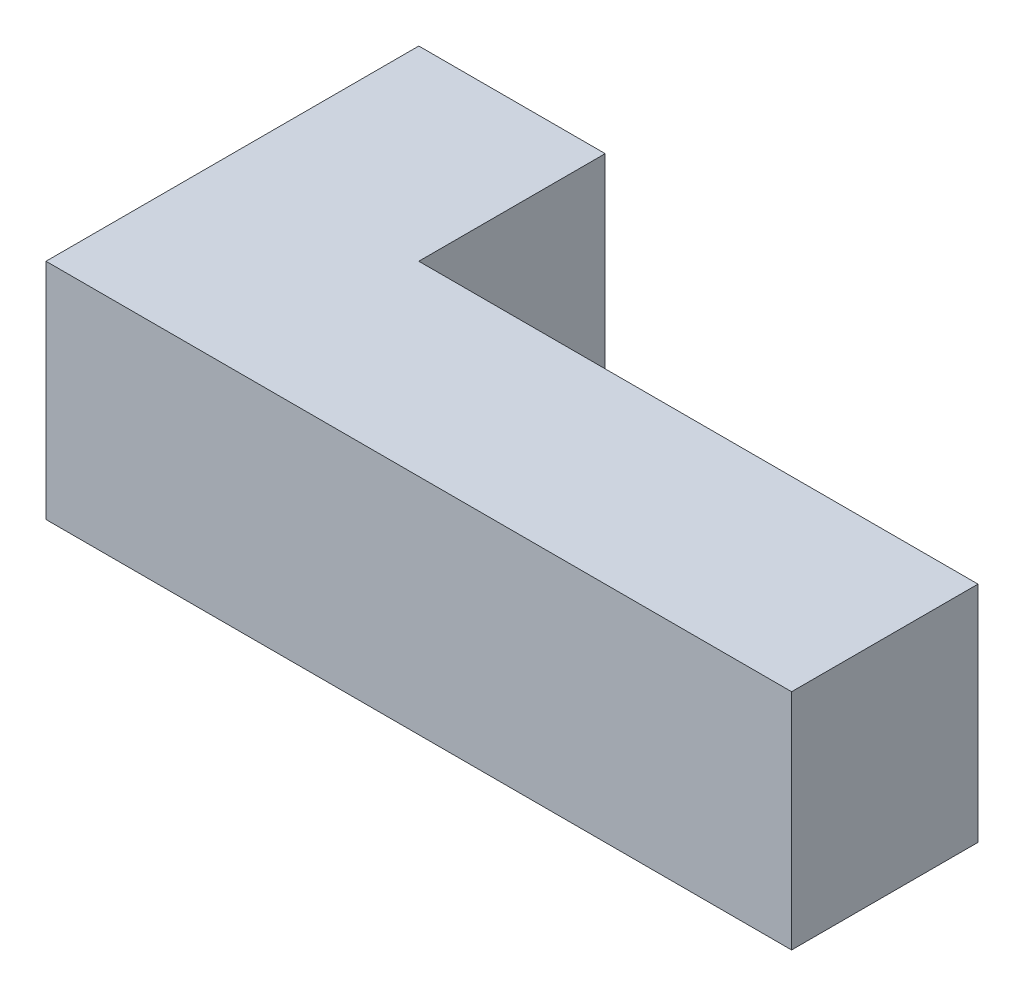
ISO-10303-21;
HEADER;
FILE_DESCRIPTION(('STEP AP214'),'2;1');
FILE_NAME('part.step','',(''),(''),'','','');
FILE_SCHEMA(('AUTOMOTIVE_DESIGN { 1 0 10303 214 1 1 1 1 }'));
ENDSEC;
DATA;
#1=APPLICATION_CONTEXT('core data for automotive mechanical design processes');
#2=APPLICATION_PROTOCOL_DEFINITION('international standard','automotive_design',2000,#1);
#3=PRODUCT_CONTEXT('',#1,'mechanical');
#4=PRODUCT('Part','Part','',(#3));
#5=PRODUCT_RELATED_PRODUCT_CATEGORY('part','',(#4));
#6=PRODUCT_DEFINITION_FORMATION('','',#4);
#7=PRODUCT_DEFINITION_CONTEXT('part definition',#1,'design');
#8=PRODUCT_DEFINITION('design','',#6,#7);
#9=PRODUCT_DEFINITION_SHAPE('','',#8);
#10=(LENGTH_UNIT() NAMED_UNIT(*) SI_UNIT(.MILLI.,.METRE.));
#11=(NAMED_UNIT(*) PLANE_ANGLE_UNIT() SI_UNIT($,.RADIAN.));
#12=(NAMED_UNIT(*) SI_UNIT($,.STERADIAN.) SOLID_ANGLE_UNIT());
#13=UNCERTAINTY_MEASURE_WITH_UNIT(LENGTH_MEASURE(1.E-05),#10,'distance_accuracy_value','');
#14=(GEOMETRIC_REPRESENTATION_CONTEXT(3) GLOBAL_UNCERTAINTY_ASSIGNED_CONTEXT((#13)) GLOBAL_UNIT_ASSIGNED_CONTEXT((#10,
#11,#12)) REPRESENTATION_CONTEXT('',''));
#15=CARTESIAN_POINT('',(0.,0.,0.));
#16=DIRECTION('',(0.,0.,1.));
#17=DIRECTION('',(1.,0.,0.));
#18=AXIS2_PLACEMENT_3D('',#15,#16,#17);
#19=CARTESIAN_POINT('',(100.,30.,0.));
#20=DIRECTION('',(1.,0.,0.));
#21=DIRECTION('',(0.,0.,-1.));
#22=AXIS2_PLACEMENT_3D('',#19,#20,#21);
#23=PLANE('',#22);
#24=DIRECTION('',(0.,0.,1.));
#25=VECTOR('',#24,1.);
#26=CARTESIAN_POINT('',(100.,0.,0.));
#27=LINE('',#26,#25);
#28=CARTESIAN_POINT('',(100.,0.,-25.));
#29=VERTEX_POINT('',#28);
#30=CARTESIAN_POINT('',(100.,0.,0.));
#31=VERTEX_POINT('',#30);
#32=EDGE_CURVE('E125',#29,#31,#27,.T.);
#33=ORIENTED_EDGE('',*,*,#32,.F.);
#34=DIRECTION('',(0.,-1.,0.));
#35=VECTOR('',#34,1.);
#36=CARTESIAN_POINT('',(100.,30.,-25.));
#37=LINE('',#36,#35);
#38=CARTESIAN_POINT('',(100.,30.,-25.));
#39=VERTEX_POINT('',#38);
#40=EDGE_CURVE('E11',#39,#29,#37,.T.);
#41=ORIENTED_EDGE('',*,*,#40,.F.);
#42=DIRECTION('',(0.,0.,1.));
#43=VECTOR('',#42,1.);
#44=CARTESIAN_POINT('',(100.,30.,0.));
#45=LINE('',#44,#43);
#46=CARTESIAN_POINT('',(100.,30.,0.));
#47=VERTEX_POINT('',#46);
#48=EDGE_CURVE('E145',#39,#47,#45,.T.);
#49=ORIENTED_EDGE('',*,*,#48,.T.);
#50=DIRECTION('',(0.,-1.,0.));
#51=VECTOR('',#50,1.);
#52=CARTESIAN_POINT('',(100.,30.,0.));
#53=LINE('',#52,#51);
#54=EDGE_CURVE('E84',#47,#31,#53,.T.);
#55=ORIENTED_EDGE('',*,*,#54,.T.);
#56=EDGE_LOOP('',(#33,#41,#49,#55));
#57=FACE_BOUND('',#56,.T.);
#58=ADVANCED_FACE('F39',(#57),#23,.T.);
#59=CARTESIAN_POINT('',(0.,30.,-25.));
#60=DIRECTION('',(0.,0.,-1.));
#61=DIRECTION('',(-1.,0.,0.));
#62=AXIS2_PLACEMENT_3D('',#59,#60,#61);
#63=PLANE('',#62);
#64=DIRECTION('',(1.,0.,0.));
#65=VECTOR('',#64,1.);
#66=CARTESIAN_POINT('',(0.,0.,-25.));
#67=LINE('',#66,#65);
#68=CARTESIAN_POINT('',(25.,0.,-25.));
#69=VERTEX_POINT('',#68);
#70=EDGE_CURVE('E129',#69,#29,#67,.T.);
#71=ORIENTED_EDGE('',*,*,#70,.F.);
#72=DIRECTION('',(0.,-1.,0.));
#73=VECTOR('',#72,1.);
#74=CARTESIAN_POINT('',(25.,30.,-25.));
#75=LINE('',#74,#73);
#76=CARTESIAN_POINT('',(25.,30.,-25.));
#77=VERTEX_POINT('',#76);
#78=EDGE_CURVE('E48',#77,#69,#75,.T.);
#79=ORIENTED_EDGE('',*,*,#78,.F.);
#80=DIRECTION('',(1.,0.,0.));
#81=VECTOR('',#80,1.);
#82=CARTESIAN_POINT('',(0.,30.,-25.));
#83=LINE('',#82,#81);
#84=EDGE_CURVE('E163',#77,#39,#83,.T.);
#85=ORIENTED_EDGE('',*,*,#84,.T.);
#86=ORIENTED_EDGE('',*,*,#40,.T.);
#87=EDGE_LOOP('',(#71,#79,#85,#86));
#88=FACE_BOUND('',#87,.T.);
#89=ADVANCED_FACE('F158',(#88),#63,.T.);
#90=CARTESIAN_POINT('',(25.,30.,0.));
#91=DIRECTION('',(1.,0.,0.));
#92=DIRECTION('',(0.,0.,-1.));
#93=AXIS2_PLACEMENT_3D('',#90,#91,#92);
#94=PLANE('',#93);
#95=DIRECTION('',(0.,0.,1.));
#96=VECTOR('',#95,1.);
#97=CARTESIAN_POINT('',(25.,0.,0.));
#98=LINE('',#97,#96);
#99=CARTESIAN_POINT('',(25.,0.,-50.));
#100=VERTEX_POINT('',#99);
#101=EDGE_CURVE('E133',#100,#69,#98,.T.);
#102=ORIENTED_EDGE('',*,*,#101,.F.);
#103=DIRECTION('',(0.,-1.,0.));
#104=VECTOR('',#103,1.);
#105=CARTESIAN_POINT('',(25.,30.,-50.));
#106=LINE('',#105,#104);
#107=CARTESIAN_POINT('',(25.,30.,-50.));
#108=VERTEX_POINT('',#107);
#109=EDGE_CURVE('E108',#108,#100,#106,.T.);
#110=ORIENTED_EDGE('',*,*,#109,.F.);
#111=DIRECTION('',(0.,0.,1.));
#112=VECTOR('',#111,1.);
#113=CARTESIAN_POINT('',(25.,30.,0.));
#114=LINE('',#113,#112);
#115=EDGE_CURVE('E115',#108,#77,#114,.T.);
#116=ORIENTED_EDGE('',*,*,#115,.T.);
#117=ORIENTED_EDGE('',*,*,#78,.T.);
#118=EDGE_LOOP('',(#102,#110,#116,#117));
#119=FACE_BOUND('',#118,.T.);
#120=ADVANCED_FACE('F155',(#119),#94,.T.);
#121=CARTESIAN_POINT('',(0.,30.,-50.));
#122=DIRECTION('',(0.,0.,-1.));
#123=DIRECTION('',(-1.,0.,0.));
#124=AXIS2_PLACEMENT_3D('',#121,#122,#123);
#125=PLANE('',#124);
#126=DIRECTION('',(1.,0.,0.));
#127=VECTOR('',#126,1.);
#128=CARTESIAN_POINT('',(0.,0.,-50.));
#129=LINE('',#128,#127);
#130=CARTESIAN_POINT('',(0.,0.,-50.));
#131=VERTEX_POINT('',#130);
#132=EDGE_CURVE('E102',#131,#100,#129,.T.);
#133=ORIENTED_EDGE('',*,*,#132,.F.);
#134=DIRECTION('',(0.,-1.,0.));
#135=VECTOR('',#134,1.);
#136=CARTESIAN_POINT('',(0.,30.,-50.));
#137=LINE('',#136,#135);
#138=CARTESIAN_POINT('',(0.,30.,-50.));
#139=VERTEX_POINT('',#138);
#140=EDGE_CURVE('E97',#139,#131,#137,.T.);
#141=ORIENTED_EDGE('',*,*,#140,.F.);
#142=DIRECTION('',(1.,0.,0.));
#143=VECTOR('',#142,1.);
#144=CARTESIAN_POINT('',(0.,30.,-50.));
#145=LINE('',#144,#143);
#146=EDGE_CURVE('E100',#139,#108,#145,.T.);
#147=ORIENTED_EDGE('',*,*,#146,.T.);
#148=ORIENTED_EDGE('',*,*,#109,.T.);
#149=EDGE_LOOP('',(#133,#141,#147,#148));
#150=FACE_BOUND('',#149,.T.);
#151=ADVANCED_FACE('F99',(#150),#125,.T.);
#152=CARTESIAN_POINT('',(0.,30.,0.));
#153=DIRECTION('',(-1.,0.,0.));
#154=DIRECTION('',(0.,0.,1.));
#155=AXIS2_PLACEMENT_3D('',#152,#153,#154);
#156=PLANE('',#155);
#157=DIRECTION('',(0.,0.,-1.));
#158=VECTOR('',#157,1.);
#159=CARTESIAN_POINT('',(0.,0.,0.));
#160=LINE('',#159,#158);
#161=CARTESIAN_POINT('',(0.,0.,0.));
#162=VERTEX_POINT('',#161);
#163=EDGE_CURVE('E139',#162,#131,#160,.T.);
#164=ORIENTED_EDGE('',*,*,#163,.F.);
#165=DIRECTION('',(0.,-1.,0.));
#166=VECTOR('',#165,1.);
#167=CARTESIAN_POINT('',(0.,30.,0.));
#168=LINE('',#167,#166);
#169=CARTESIAN_POINT('',(0.,30.,0.));
#170=VERTEX_POINT('',#169);
#171=EDGE_CURVE('E77',#170,#162,#168,.T.);
#172=ORIENTED_EDGE('',*,*,#171,.F.);
#173=DIRECTION('',(0.,0.,-1.));
#174=VECTOR('',#173,1.);
#175=CARTESIAN_POINT('',(0.,30.,0.));
#176=LINE('',#175,#174);
#177=EDGE_CURVE('E112',#170,#139,#176,.T.);
#178=ORIENTED_EDGE('',*,*,#177,.T.);
#179=ORIENTED_EDGE('',*,*,#140,.T.);
#180=EDGE_LOOP('',(#164,#172,#178,#179));
#181=FACE_BOUND('',#180,.T.);
#182=ADVANCED_FACE('F118',(#181),#156,.T.);
#183=CARTESIAN_POINT('',(0.,30.,0.));
#184=DIRECTION('',(0.,0.,-1.));
#185=DIRECTION('',(-1.,0.,0.));
#186=AXIS2_PLACEMENT_3D('',#183,#184,#185);
#187=PLANE('',#186);
#188=DIRECTION('',(1.,0.,0.));
#189=VECTOR('',#188,1.);
#190=CARTESIAN_POINT('',(0.,0.,0.));
#191=LINE('',#190,#189);
#192=EDGE_CURVE('E142',#162,#31,#191,.T.);
#193=ORIENTED_EDGE('',*,*,#192,.T.);
#194=ORIENTED_EDGE('',*,*,#54,.F.);
#195=DIRECTION('',(1.,0.,0.));
#196=VECTOR('',#195,1.);
#197=CARTESIAN_POINT('',(0.,30.,0.));
#198=LINE('',#197,#196);
#199=EDGE_CURVE('E56',#170,#47,#198,.T.);
#200=ORIENTED_EDGE('',*,*,#199,.F.);
#201=ORIENTED_EDGE('',*,*,#171,.T.);
#202=EDGE_LOOP('',(#193,#194,#200,#201));
#203=FACE_BOUND('',#202,.T.);
#204=ADVANCED_FACE('F161',(#203),#187,.F.);
#205=CARTESIAN_POINT('',(0.,30.,0.));
#206=DIRECTION('',(0.,1.,0.));
#207=DIRECTION('',(0.,0.,1.));
#208=AXIS2_PLACEMENT_3D('',#205,#206,#207);
#209=PLANE('',#208);
#210=ORIENTED_EDGE('',*,*,#48,.F.);
#211=ORIENTED_EDGE('',*,*,#84,.F.);
#212=ORIENTED_EDGE('',*,*,#115,.F.);
#213=ORIENTED_EDGE('',*,*,#146,.F.);
#214=ORIENTED_EDGE('',*,*,#177,.F.);
#215=ORIENTED_EDGE('',*,*,#199,.T.);
#216=EDGE_LOOP('',(#210,#211,#212,#213,#214,#215));
#217=FACE_BOUND('',#216,.T.);
#218=ADVANCED_FACE('F111',(#217),#209,.T.);
#219=CARTESIAN_POINT('',(0.,0.,0.));
#220=DIRECTION('',(0.,1.,0.));
#221=DIRECTION('',(0.,0.,1.));
#222=AXIS2_PLACEMENT_3D('',#219,#220,#221);
#223=PLANE('',#222);
#224=ORIENTED_EDGE('',*,*,#32,.T.);
#225=ORIENTED_EDGE('',*,*,#192,.F.);
#226=ORIENTED_EDGE('',*,*,#163,.T.);
#227=ORIENTED_EDGE('',*,*,#132,.T.);
#228=ORIENTED_EDGE('',*,*,#101,.T.);
#229=ORIENTED_EDGE('',*,*,#70,.T.);
#230=EDGE_LOOP('',(#224,#225,#226,#227,#228,#229));
#231=FACE_BOUND('',#230,.T.);
#232=ADVANCED_FACE('F160',(#231),#223,.F.);
#233=CLOSED_SHELL('',(#58,#89,#120,#151,#182,#204,#218,#232));
#234=MANIFOLD_SOLID_BREP('B2',#233);
#235=ADVANCED_BREP_SHAPE_REPRESENTATION('',(#18,#234),#14);
#236=SHAPE_DEFINITION_REPRESENTATION(#9,#235);
ENDSEC;
END-ISO-10303-21;
